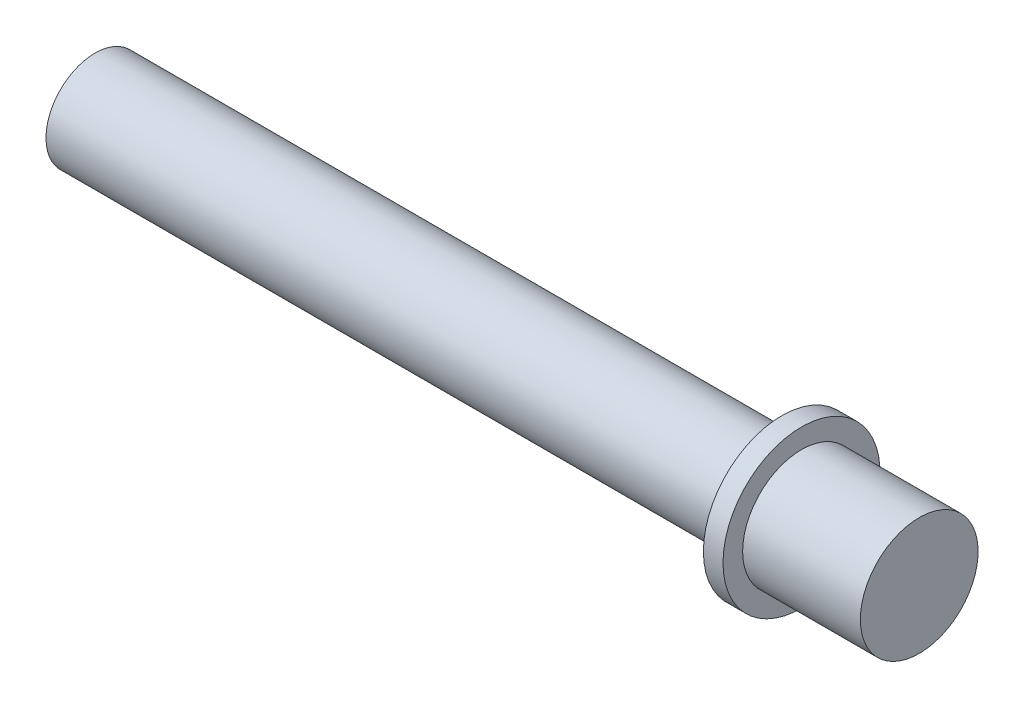
ISO-10303-21;
HEADER;
FILE_DESCRIPTION(('STEP AP214'),'2;1');
FILE_NAME('part.step','',(''),(''),'','','');
FILE_SCHEMA(('AUTOMOTIVE_DESIGN { 1 0 10303 214 1 1 1 1 }'));
ENDSEC;
DATA;
#1=APPLICATION_CONTEXT('core data for automotive mechanical design processes');
#2=APPLICATION_PROTOCOL_DEFINITION('international standard','automotive_design',2000,#1);
#3=PRODUCT_CONTEXT('',#1,'mechanical');
#4=PRODUCT('Part','Part','',(#3));
#5=PRODUCT_RELATED_PRODUCT_CATEGORY('part','',(#4));
#6=PRODUCT_DEFINITION_FORMATION('','',#4);
#7=PRODUCT_DEFINITION_CONTEXT('part definition',#1,'design');
#8=PRODUCT_DEFINITION('design','',#6,#7);
#9=PRODUCT_DEFINITION_SHAPE('','',#8);
#10=(LENGTH_UNIT() NAMED_UNIT(*) SI_UNIT(.MILLI.,.METRE.));
#11=(NAMED_UNIT(*) PLANE_ANGLE_UNIT() SI_UNIT($,.RADIAN.));
#12=(NAMED_UNIT(*) SI_UNIT($,.STERADIAN.) SOLID_ANGLE_UNIT());
#13=UNCERTAINTY_MEASURE_WITH_UNIT(LENGTH_MEASURE(1.E-05),#10,'distance_accuracy_value','');
#14=(GEOMETRIC_REPRESENTATION_CONTEXT(3) GLOBAL_UNCERTAINTY_ASSIGNED_CONTEXT((#13)) GLOBAL_UNIT_ASSIGNED_CONTEXT((#10,
#11,#12)) REPRESENTATION_CONTEXT('',''));
#15=CARTESIAN_POINT('',(0.,0.,0.));
#16=DIRECTION('',(0.,0.,1.));
#17=DIRECTION('',(1.,0.,0.));
#18=AXIS2_PLACEMENT_3D('',#15,#16,#17);
#19=CARTESIAN_POINT('',(0.,0.,0.));
#20=DIRECTION('',(-1.,0.,0.));
#21=DIRECTION('',(0.,0.,1.));
#22=AXIS2_PLACEMENT_3D('',#19,#20,#21);
#23=PLANE('',#22);
#24=CARTESIAN_POINT('',(0.,0.,0.));
#25=DIRECTION('',(-1.,0.,0.));
#26=DIRECTION('',(0.,0.,1.));
#27=AXIS2_PLACEMENT_3D('',#24,#25,#26);
#28=CIRCLE('',#27,6.);
#29=CARTESIAN_POINT('',(0.,0.,6.));
#30=VERTEX_POINT('',#29);
#31=EDGE_CURVE('E10',#30,#30,#28,.T.);
#32=ORIENTED_EDGE('',*,*,#31,.F.);
#33=EDGE_LOOP('',(#32));
#34=FACE_BOUND('',#33,.T.);
#35=ADVANCED_FACE('F39',(#34),#23,.F.);
#36=CARTESIAN_POINT('',(-84.,0.,0.));
#37=DIRECTION('',(-1.,0.,0.));
#38=DIRECTION('',(0.,0.,1.));
#39=AXIS2_PLACEMENT_3D('',#36,#37,#38);
#40=CYLINDRICAL_SURFACE('',#39,6.);
#41=CARTESIAN_POINT('',(-12.,0.,0.));
#42=DIRECTION('',(-1.,0.,0.));
#43=DIRECTION('',(0.,0.,1.));
#44=AXIS2_PLACEMENT_3D('',#41,#42,#43);
#45=CIRCLE('',#44,6.);
#46=CARTESIAN_POINT('',(-12.,0.,6.));
#47=VERTEX_POINT('',#46);
#48=EDGE_CURVE('E46',#47,#47,#45,.T.);
#49=ORIENTED_EDGE('',*,*,#48,.F.);
#50=EDGE_LOOP('',(#49));
#51=FACE_BOUND('',#50,.T.);
#52=ORIENTED_EDGE('',*,*,#31,.T.);
#53=EDGE_LOOP('',(#52));
#54=FACE_BOUND('',#53,.T.);
#55=ADVANCED_FACE('F96',(#51,#54),#40,.T.);
#56=CARTESIAN_POINT('',(-12.,6.,0.));
#57=DIRECTION('',(-1.,0.,0.));
#58=DIRECTION('',(0.,0.,1.));
#59=AXIS2_PLACEMENT_3D('',#56,#57,#58);
#60=PLANE('',#59);
#61=CARTESIAN_POINT('',(-12.,0.,0.));
#62=DIRECTION('',(-1.,0.,0.));
#63=DIRECTION('',(0.,0.,1.));
#64=AXIS2_PLACEMENT_3D('',#61,#62,#63);
#65=CIRCLE('',#64,8.);
#66=CARTESIAN_POINT('',(-12.,0.,8.));
#67=VERTEX_POINT('',#66);
#68=EDGE_CURVE('E52',#67,#67,#65,.T.);
#69=ORIENTED_EDGE('',*,*,#68,.F.);
#70=EDGE_LOOP('',(#69));
#71=FACE_BOUND('',#70,.T.);
#72=ORIENTED_EDGE('',*,*,#48,.T.);
#73=EDGE_LOOP('',(#72));
#74=FACE_BOUND('',#73,.T.);
#75=ADVANCED_FACE('F91',(#71,#74),#60,.F.);
#76=CARTESIAN_POINT('',(-84.,0.,0.));
#77=DIRECTION('',(-1.,0.,0.));
#78=DIRECTION('',(0.,0.,1.));
#79=AXIS2_PLACEMENT_3D('',#76,#77,#78);
#80=CYLINDRICAL_SURFACE('',#79,8.);
#81=CARTESIAN_POINT('',(-14.,0.,0.));
#82=DIRECTION('',(-1.,0.,0.));
#83=DIRECTION('',(0.,0.,1.));
#84=AXIS2_PLACEMENT_3D('',#81,#82,#83);
#85=CIRCLE('',#84,8.);
#86=CARTESIAN_POINT('',(-14.,0.,8.));
#87=VERTEX_POINT('',#86);
#88=EDGE_CURVE('E58',#87,#87,#85,.T.);
#89=ORIENTED_EDGE('',*,*,#88,.F.);
#90=EDGE_LOOP('',(#89));
#91=FACE_BOUND('',#90,.T.);
#92=ORIENTED_EDGE('',*,*,#68,.T.);
#93=EDGE_LOOP('',(#92));
#94=FACE_BOUND('',#93,.T.);
#95=ADVANCED_FACE('F85',(#91,#94),#80,.T.);
#96=CARTESIAN_POINT('',(-14.,8.,0.));
#97=DIRECTION('',(1.,0.,0.));
#98=DIRECTION('',(0.,0.,-1.));
#99=AXIS2_PLACEMENT_3D('',#96,#97,#98);
#100=PLANE('',#99);
#101=CARTESIAN_POINT('',(-14.,0.,0.));
#102=DIRECTION('',(-1.,0.,0.));
#103=DIRECTION('',(0.,0.,1.));
#104=AXIS2_PLACEMENT_3D('',#101,#102,#103);
#105=CIRCLE('',#104,5.00000000000001);
#106=CARTESIAN_POINT('',(-14.,0.,5.00000000000001));
#107=VERTEX_POINT('',#106);
#108=EDGE_CURVE('E64',#107,#107,#105,.T.);
#109=ORIENTED_EDGE('',*,*,#108,.F.);
#110=EDGE_LOOP('',(#109));
#111=FACE_BOUND('',#110,.T.);
#112=ORIENTED_EDGE('',*,*,#88,.T.);
#113=EDGE_LOOP('',(#112));
#114=FACE_BOUND('',#113,.T.);
#115=ADVANCED_FACE('F79',(#111,#114),#100,.F.);
#116=CARTESIAN_POINT('',(-84.,0.,0.));
#117=DIRECTION('',(-1.,0.,0.));
#118=DIRECTION('',(0.,0.,1.));
#119=AXIS2_PLACEMENT_3D('',#116,#117,#118);
#120=CYLINDRICAL_SURFACE('',#119,5.);
#121=CARTESIAN_POINT('',(-84.,0.,0.));
#122=DIRECTION('',(-1.,0.,0.));
#123=DIRECTION('',(0.,0.,1.));
#124=AXIS2_PLACEMENT_3D('',#121,#122,#123);
#125=CIRCLE('',#124,5.);
#126=CARTESIAN_POINT('',(-84.,0.,5.));
#127=VERTEX_POINT('',#126);
#128=EDGE_CURVE('E68',#127,#127,#125,.T.);
#129=ORIENTED_EDGE('',*,*,#128,.F.);
#130=EDGE_LOOP('',(#129));
#131=FACE_BOUND('',#130,.T.);
#132=ORIENTED_EDGE('',*,*,#108,.T.);
#133=EDGE_LOOP('',(#132));
#134=FACE_BOUND('',#133,.T.);
#135=ADVANCED_FACE('F76',(#131,#134),#120,.T.);
#136=CARTESIAN_POINT('',(-84.,5.,0.));
#137=DIRECTION('',(1.,0.,0.));
#138=DIRECTION('',(0.,0.,-1.));
#139=AXIS2_PLACEMENT_3D('',#136,#137,#138);
#140=PLANE('',#139);
#141=ORIENTED_EDGE('',*,*,#128,.T.);
#142=EDGE_LOOP('',(#141));
#143=FACE_BOUND('',#142,.T.);
#144=ADVANCED_FACE('F74',(#143),#140,.F.);
#145=CLOSED_SHELL('',(#35,#55,#75,#95,#115,#135,#144));
#146=MANIFOLD_SOLID_BREP('B2',#145);
#147=ADVANCED_BREP_SHAPE_REPRESENTATION('',(#18,#146),#14);
#148=SHAPE_DEFINITION_REPRESENTATION(#9,#147);
ENDSEC;
END-ISO-10303-21;
